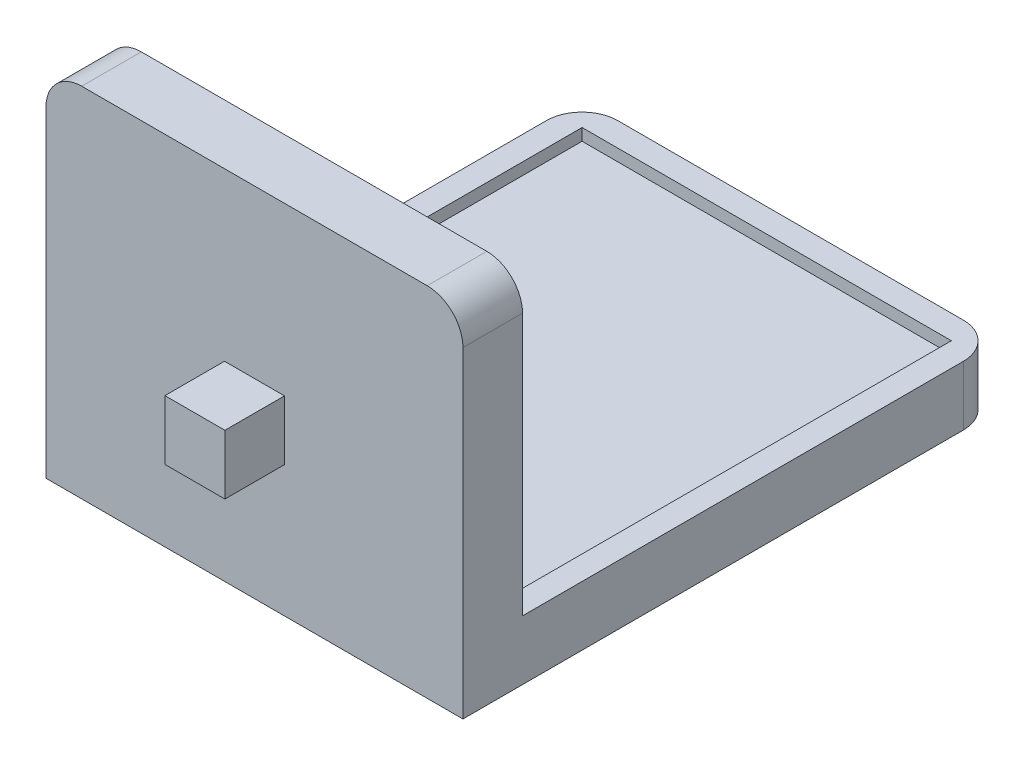
ISO-10303-21;
HEADER;
FILE_DESCRIPTION(('STEP AP214'),'2;1');
FILE_NAME('part.step','',(''),(''),'','','');
FILE_SCHEMA(('AUTOMOTIVE_DESIGN { 1 0 10303 214 1 1 1 1 }'));
ENDSEC;
DATA;
#1=APPLICATION_CONTEXT('core data for automotive mechanical design processes');
#2=APPLICATION_PROTOCOL_DEFINITION('international standard','automotive_design',2000,#1);
#3=PRODUCT_CONTEXT('',#1,'mechanical');
#4=PRODUCT('Part','Part','',(#3));
#5=PRODUCT_RELATED_PRODUCT_CATEGORY('part','',(#4));
#6=PRODUCT_DEFINITION_FORMATION('','',#4);
#7=PRODUCT_DEFINITION_CONTEXT('part definition',#1,'design');
#8=PRODUCT_DEFINITION('design','',#6,#7);
#9=PRODUCT_DEFINITION_SHAPE('','',#8);
#10=(LENGTH_UNIT() NAMED_UNIT(*) SI_UNIT(.MILLI.,.METRE.));
#11=(NAMED_UNIT(*) PLANE_ANGLE_UNIT() SI_UNIT($,.RADIAN.));
#12=(NAMED_UNIT(*) SI_UNIT($,.STERADIAN.) SOLID_ANGLE_UNIT());
#13=UNCERTAINTY_MEASURE_WITH_UNIT(LENGTH_MEASURE(1.E-05),#10,'distance_accuracy_value','');
#14=(GEOMETRIC_REPRESENTATION_CONTEXT(3) GLOBAL_UNCERTAINTY_ASSIGNED_CONTEXT((#13)) GLOBAL_UNIT_ASSIGNED_CONTEXT((#10,
#11,#12)) REPRESENTATION_CONTEXT('',''));
#15=CARTESIAN_POINT('',(0.,0.,0.));
#16=DIRECTION('',(0.,0.,1.));
#17=DIRECTION('',(1.,0.,0.));
#18=AXIS2_PLACEMENT_3D('',#15,#16,#17);
#19=CARTESIAN_POINT('',(0.,0.,5.));
#20=DIRECTION('',(0.,0.,-1.));
#21=DIRECTION('',(-1.,0.,0.));
#22=AXIS2_PLACEMENT_3D('',#19,#20,#21);
#23=PLANE('',#22);
#24=DIRECTION('',(0.,1.,0.));
#25=VECTOR('',#24,1.);
#26=CARTESIAN_POINT('',(35.,0.,5.));
#27=LINE('',#26,#25);
#28=CARTESIAN_POINT('',(35.,0.,5.));
#29=VERTEX_POINT('',#28);
#30=CARTESIAN_POINT('',(35.,27.,5.));
#31=VERTEX_POINT('',#30);
#32=EDGE_CURVE('E234',#29,#31,#27,.T.);
#33=ORIENTED_EDGE('',*,*,#32,.T.);
#34=CARTESIAN_POINT('',(32.,27.,5.));
#35=DIRECTION('',(0.,0.,-1.));
#36=DIRECTION('',(-1.,0.,0.));
#37=AXIS2_PLACEMENT_3D('',#34,#35,#36);
#38=CIRCLE('',#37,3.);
#39=CARTESIAN_POINT('',(32.,30.,5.));
#40=VERTEX_POINT('',#39);
#41=EDGE_CURVE('E69',#31,#40,#38,.F.);
#42=ORIENTED_EDGE('',*,*,#41,.T.);
#43=DIRECTION('',(-1.,0.,0.));
#44=VECTOR('',#43,1.);
#45=CARTESIAN_POINT('',(0.,30.,5.));
#46=LINE('',#45,#44);
#47=CARTESIAN_POINT('',(3.,30.,5.));
#48=VERTEX_POINT('',#47);
#49=EDGE_CURVE('E238',#40,#48,#46,.T.);
#50=ORIENTED_EDGE('',*,*,#49,.T.);
#51=CARTESIAN_POINT('',(3.,27.,5.));
#52=DIRECTION('',(0.,0.,-1.));
#53=DIRECTION('',(-1.,0.,0.));
#54=AXIS2_PLACEMENT_3D('',#51,#52,#53);
#55=CIRCLE('',#54,3.);
#56=CARTESIAN_POINT('',(0.,27.,5.));
#57=VERTEX_POINT('',#56);
#58=EDGE_CURVE('E84',#48,#57,#55,.F.);
#59=ORIENTED_EDGE('',*,*,#58,.T.);
#60=DIRECTION('',(0.,-1.,0.));
#61=VECTOR('',#60,1.);
#62=CARTESIAN_POINT('',(0.,0.,5.));
#63=LINE('',#62,#61);
#64=CARTESIAN_POINT('',(0.,0.,5.));
#65=VERTEX_POINT('',#64);
#66=EDGE_CURVE('E226',#57,#65,#63,.T.);
#67=ORIENTED_EDGE('',*,*,#66,.T.);
#68=DIRECTION('',(1.,0.,0.));
#69=VECTOR('',#68,1.);
#70=CARTESIAN_POINT('',(0.,0.,5.));
#71=LINE('',#70,#69);
#72=EDGE_CURVE('E229',#65,#29,#71,.T.);
#73=ORIENTED_EDGE('',*,*,#72,.T.);
#74=EDGE_LOOP('',(#33,#42,#50,#59,#67,#73));
#75=FACE_BOUND('',#74,.T.);
#76=DIRECTION('',(1.,0.,0.));
#77=VECTOR('',#76,1.);
#78=CARTESIAN_POINT('',(0.,11.,5.));
#79=LINE('',#78,#77);
#80=CARTESIAN_POINT('',(14.9819164068884,11.,5.));
#81=VERTEX_POINT('',#80);
#82=CARTESIAN_POINT('',(20.0180835931116,11.,5.));
#83=VERTEX_POINT('',#82);
#84=EDGE_CURVE('E212',#81,#83,#79,.T.);
#85=ORIENTED_EDGE('',*,*,#84,.F.);
#86=DIRECTION('',(0.,1.,0.));
#87=VECTOR('',#86,1.);
#88=CARTESIAN_POINT('',(14.9819164068884,0.,5.));
#89=LINE('',#88,#87);
#90=CARTESIAN_POINT('',(14.9819164068884,16.,5.));
#91=VERTEX_POINT('',#90);
#92=EDGE_CURVE('E208',#81,#91,#89,.T.);
#93=ORIENTED_EDGE('',*,*,#92,.T.);
#94=DIRECTION('',(1.,0.,0.));
#95=VECTOR('',#94,1.);
#96=CARTESIAN_POINT('',(0.,16.,5.));
#97=LINE('',#96,#95);
#98=CARTESIAN_POINT('',(20.0180835931116,16.,5.));
#99=VERTEX_POINT('',#98);
#100=EDGE_CURVE('E76',#91,#99,#97,.T.);
#101=ORIENTED_EDGE('',*,*,#100,.T.);
#102=DIRECTION('',(0.,1.,0.));
#103=VECTOR('',#102,1.);
#104=CARTESIAN_POINT('',(20.0180835931116,0.,5.));
#105=LINE('',#104,#103);
#106=EDGE_CURVE('E558',#83,#99,#105,.T.);
#107=ORIENTED_EDGE('',*,*,#106,.F.);
#108=EDGE_LOOP('',(#85,#93,#101,#107));
#109=FACE_BOUND('',#108,.T.);
#110=ADVANCED_FACE('F60',(#75,#109),#23,.F.);
#111=CARTESIAN_POINT('',(0.,5.,0.));
#112=DIRECTION('',(1.,0.,0.));
#113=DIRECTION('',(0.,0.,-1.));
#114=AXIS2_PLACEMENT_3D('',#111,#112,#113);
#115=PLANE('',#114);
#116=ORIENTED_EDGE('',*,*,#66,.F.);
#117=DIRECTION('',(0.,0.,-1.));
#118=VECTOR('',#117,1.);
#119=CARTESIAN_POINT('',(0.,27.,0.));
#120=LINE('',#119,#118);
#121=CARTESIAN_POINT('',(0.,27.,0.));
#122=VERTEX_POINT('',#121);
#123=EDGE_CURVE('E11',#57,#122,#120,.T.);
#124=ORIENTED_EDGE('',*,*,#123,.T.);
#125=DIRECTION('',(0.,-1.,0.));
#126=VECTOR('',#125,1.);
#127=CARTESIAN_POINT('',(0.,0.,0.));
#128=LINE('',#127,#126);
#129=CARTESIAN_POINT('',(0.,5.,0.));
#130=VERTEX_POINT('',#129);
#131=EDGE_CURVE('E215',#122,#130,#128,.T.);
#132=ORIENTED_EDGE('',*,*,#131,.T.);
#133=DIRECTION('',(0.,0.,1.));
#134=VECTOR('',#133,1.);
#135=CARTESIAN_POINT('',(0.,5.,0.));
#136=LINE('',#135,#134);
#137=CARTESIAN_POINT('',(0.,5.,-37.));
#138=VERTEX_POINT('',#137);
#139=EDGE_CURVE('E292',#138,#130,#136,.T.);
#140=ORIENTED_EDGE('',*,*,#139,.F.);
#141=DIRECTION('',(0.,-1.,0.));
#142=VECTOR('',#141,1.);
#143=CARTESIAN_POINT('',(0.,5.,-37.));
#144=LINE('',#143,#142);
#145=CARTESIAN_POINT('',(0.,0.,-37.));
#146=VERTEX_POINT('',#145);
#147=EDGE_CURVE('E308',#138,#146,#144,.T.);
#148=ORIENTED_EDGE('',*,*,#147,.T.);
#149=DIRECTION('',(0.,0.,1.));
#150=VECTOR('',#149,1.);
#151=CARTESIAN_POINT('',(0.,0.,0.));
#152=LINE('',#151,#150);
#153=EDGE_CURVE('E282',#146,#65,#152,.T.);
#154=ORIENTED_EDGE('',*,*,#153,.T.);
#155=EDGE_LOOP('',(#116,#124,#132,#140,#148,#154));
#156=FACE_BOUND('',#155,.T.);
#157=ADVANCED_FACE('F404',(#156),#115,.F.);
#158=CARTESIAN_POINT('',(35.,5.,0.));
#159=DIRECTION('',(-1.,0.,0.));
#160=DIRECTION('',(0.,0.,1.));
#161=AXIS2_PLACEMENT_3D('',#158,#159,#160);
#162=PLANE('',#161);
#163=DIRECTION('',(0.,1.,0.));
#164=VECTOR('',#163,1.);
#165=CARTESIAN_POINT('',(35.,0.,0.));
#166=LINE('',#165,#164);
#167=CARTESIAN_POINT('',(35.,5.,0.));
#168=VERTEX_POINT('',#167);
#169=CARTESIAN_POINT('',(35.,27.,0.));
#170=VERTEX_POINT('',#169);
#171=EDGE_CURVE('E220',#168,#170,#166,.T.);
#172=ORIENTED_EDGE('',*,*,#171,.T.);
#173=DIRECTION('',(0.,0.,-1.));
#174=VECTOR('',#173,1.);
#175=CARTESIAN_POINT('',(35.,27.,0.));
#176=LINE('',#175,#174);
#177=EDGE_CURVE('E358',#170,#31,#176,.F.);
#178=ORIENTED_EDGE('',*,*,#177,.T.);
#179=ORIENTED_EDGE('',*,*,#32,.F.);
#180=DIRECTION('',(0.,0.,-1.));
#181=VECTOR('',#180,1.);
#182=CARTESIAN_POINT('',(35.,0.,0.));
#183=LINE('',#182,#181);
#184=CARTESIAN_POINT('',(35.,0.,-37.));
#185=VERTEX_POINT('',#184);
#186=EDGE_CURVE('E312',#29,#185,#183,.T.);
#187=ORIENTED_EDGE('',*,*,#186,.T.);
#188=DIRECTION('',(0.,-1.,0.));
#189=VECTOR('',#188,1.);
#190=CARTESIAN_POINT('',(35.,5.,-37.));
#191=LINE('',#190,#189);
#192=CARTESIAN_POINT('',(35.,5.,-37.));
#193=VERTEX_POINT('',#192);
#194=EDGE_CURVE('E339',#185,#193,#191,.F.);
#195=ORIENTED_EDGE('',*,*,#194,.T.);
#196=DIRECTION('',(0.,0.,-1.));
#197=VECTOR('',#196,1.);
#198=CARTESIAN_POINT('',(35.,5.,0.));
#199=LINE('',#198,#197);
#200=EDGE_CURVE('E301',#168,#193,#199,.T.);
#201=ORIENTED_EDGE('',*,*,#200,.F.);
#202=EDGE_LOOP('',(#172,#178,#179,#187,#195,#201));
#203=FACE_BOUND('',#202,.T.);
#204=ADVANCED_FACE('F381',(#203),#162,.F.);
#205=CARTESIAN_POINT('',(0.,5.,-40.));
#206=DIRECTION('',(0.,0.,1.));
#207=DIRECTION('',(1.,0.,0.));
#208=AXIS2_PLACEMENT_3D('',#205,#206,#207);
#209=PLANE('',#208);
#210=DIRECTION('',(-1.,0.,0.));
#211=VECTOR('',#210,1.);
#212=CARTESIAN_POINT('',(0.,5.,-40.));
#213=LINE('',#212,#211);
#214=CARTESIAN_POINT('',(32.,5.,-40.));
#215=VERTEX_POINT('',#214);
#216=CARTESIAN_POINT('',(3.,5.,-40.));
#217=VERTEX_POINT('',#216);
#218=EDGE_CURVE('E305',#215,#217,#213,.T.);
#219=ORIENTED_EDGE('',*,*,#218,.F.);
#220=DIRECTION('',(0.,-1.,0.));
#221=VECTOR('',#220,1.);
#222=CARTESIAN_POINT('',(32.,5.,-40.));
#223=LINE('',#222,#221);
#224=CARTESIAN_POINT('',(32.,0.,-40.));
#225=VERTEX_POINT('',#224);
#226=EDGE_CURVE('E332',#215,#225,#223,.T.);
#227=ORIENTED_EDGE('',*,*,#226,.T.);
#228=DIRECTION('',(-1.,0.,0.));
#229=VECTOR('',#228,1.);
#230=CARTESIAN_POINT('',(0.,0.,-40.));
#231=LINE('',#230,#229);
#232=CARTESIAN_POINT('',(3.,0.,-40.));
#233=VERTEX_POINT('',#232);
#234=EDGE_CURVE('E297',#225,#233,#231,.T.);
#235=ORIENTED_EDGE('',*,*,#234,.T.);
#236=DIRECTION('',(0.,-1.,0.));
#237=VECTOR('',#236,1.);
#238=CARTESIAN_POINT('',(3.,5.,-40.));
#239=LINE('',#238,#237);
#240=EDGE_CURVE('E325',#233,#217,#239,.F.);
#241=ORIENTED_EDGE('',*,*,#240,.T.);
#242=EDGE_LOOP('',(#219,#227,#235,#241));
#243=FACE_BOUND('',#242,.T.);
#244=ADVANCED_FACE('F392',(#243),#209,.F.);
#245=CARTESIAN_POINT('',(0.,5.,0.));
#246=DIRECTION('',(0.,-1.,0.));
#247=DIRECTION('',(0.,0.,-1.));
#248=AXIS2_PLACEMENT_3D('',#245,#246,#247);
#249=PLANE('',#248);
#250=DIRECTION('',(1.,0.,0.));
#251=VECTOR('',#250,1.);
#252=CARTESIAN_POINT('',(2.,5.,-2.));
#253=LINE('',#252,#251);
#254=CARTESIAN_POINT('',(2.,5.,-2.));
#255=VERTEX_POINT('',#254);
#256=CARTESIAN_POINT('',(33.,5.,-2.));
#257=VERTEX_POINT('',#256);
#258=EDGE_CURVE('E268',#255,#257,#253,.T.);
#259=ORIENTED_EDGE('',*,*,#258,.F.);
#260=DIRECTION('',(0.,0.,1.));
#261=VECTOR('',#260,1.);
#262=CARTESIAN_POINT('',(2.,5.,-38.));
#263=LINE('',#262,#261);
#264=CARTESIAN_POINT('',(2.,5.,-38.));
#265=VERTEX_POINT('',#264);
#266=EDGE_CURVE('E240',#265,#255,#263,.T.);
#267=ORIENTED_EDGE('',*,*,#266,.F.);
#268=DIRECTION('',(-1.,0.,0.));
#269=VECTOR('',#268,1.);
#270=CARTESIAN_POINT('',(33.,5.,-38.));
#271=LINE('',#270,#269);
#272=CARTESIAN_POINT('',(33.,5.,-38.));
#273=VERTEX_POINT('',#272);
#274=EDGE_CURVE('E253',#273,#265,#271,.T.);
#275=ORIENTED_EDGE('',*,*,#274,.F.);
#276=DIRECTION('',(0.,0.,-1.));
#277=VECTOR('',#276,1.);
#278=CARTESIAN_POINT('',(33.,5.,-2.));
#279=LINE('',#278,#277);
#280=EDGE_CURVE('E272',#257,#273,#279,.T.);
#281=ORIENTED_EDGE('',*,*,#280,.F.);
#282=EDGE_LOOP('',(#259,#267,#275,#281));
#283=FACE_BOUND('',#282,.T.);
#284=ORIENTED_EDGE('',*,*,#200,.T.);
#285=CARTESIAN_POINT('',(32.,5.,-37.));
#286=DIRECTION('',(0.,-1.,0.));
#287=DIRECTION('',(0.,0.,-1.));
#288=AXIS2_PLACEMENT_3D('',#285,#286,#287);
#289=CIRCLE('',#288,3.);
#290=EDGE_CURVE('E342',#193,#215,#289,.F.);
#291=ORIENTED_EDGE('',*,*,#290,.T.);
#292=ORIENTED_EDGE('',*,*,#218,.T.);
#293=CARTESIAN_POINT('',(3.,5.,-37.));
#294=DIRECTION('',(0.,-1.,0.));
#295=DIRECTION('',(0.,0.,-1.));
#296=AXIS2_PLACEMENT_3D('',#293,#294,#295);
#297=CIRCLE('',#296,3.);
#298=EDGE_CURVE('E329',#217,#138,#297,.F.);
#299=ORIENTED_EDGE('',*,*,#298,.T.);
#300=ORIENTED_EDGE('',*,*,#139,.T.);
#301=DIRECTION('',(1.,0.,0.));
#302=VECTOR('',#301,1.);
#303=CARTESIAN_POINT('',(0.,5.,0.));
#304=LINE('',#303,#302);
#305=EDGE_CURVE('E296',#130,#168,#304,.T.);
#306=ORIENTED_EDGE('',*,*,#305,.T.);
#307=EDGE_LOOP('',(#284,#291,#292,#299,#300,#306));
#308=FACE_BOUND('',#307,.T.);
#309=ADVANCED_FACE('F385',(#283,#308),#249,.F.);
#310=CARTESIAN_POINT('',(0.,0.,0.));
#311=DIRECTION('',(0.,-1.,0.));
#312=DIRECTION('',(0.,0.,-1.));
#313=AXIS2_PLACEMENT_3D('',#310,#311,#312);
#314=PLANE('',#313);
#315=ORIENTED_EDGE('',*,*,#234,.F.);
#316=CARTESIAN_POINT('',(32.,0.,-37.));
#317=DIRECTION('',(0.,-1.,0.));
#318=DIRECTION('',(0.,0.,-1.));
#319=AXIS2_PLACEMENT_3D('',#316,#317,#318);
#320=CIRCLE('',#319,3.);
#321=EDGE_CURVE('E336',#225,#185,#320,.T.);
#322=ORIENTED_EDGE('',*,*,#321,.T.);
#323=ORIENTED_EDGE('',*,*,#186,.F.);
#324=ORIENTED_EDGE('',*,*,#72,.F.);
#325=ORIENTED_EDGE('',*,*,#153,.F.);
#326=CARTESIAN_POINT('',(3.,0.,-37.));
#327=DIRECTION('',(0.,-1.,0.));
#328=DIRECTION('',(0.,0.,-1.));
#329=AXIS2_PLACEMENT_3D('',#326,#327,#328);
#330=CIRCLE('',#329,3.);
#331=EDGE_CURVE('E321',#146,#233,#330,.T.);
#332=ORIENTED_EDGE('',*,*,#331,.T.);
#333=EDGE_LOOP('',(#315,#322,#323,#324,#325,#332));
#334=FACE_BOUND('',#333,.T.);
#335=ADVANCED_FACE('F394',(#334),#314,.T.);
#336=CARTESIAN_POINT('',(2.,4.,-38.));
#337=DIRECTION('',(-1.,0.,0.));
#338=DIRECTION('',(0.,0.,1.));
#339=AXIS2_PLACEMENT_3D('',#336,#337,#338);
#340=PLANE('',#339);
#341=ORIENTED_EDGE('',*,*,#266,.T.);
#342=DIRECTION('',(0.,1.,0.));
#343=VECTOR('',#342,1.);
#344=CARTESIAN_POINT('',(2.,4.,-2.));
#345=LINE('',#344,#343);
#346=CARTESIAN_POINT('',(2.,4.,-2.));
#347=VERTEX_POINT('',#346);
#348=EDGE_CURVE('E265',#347,#255,#345,.T.);
#349=ORIENTED_EDGE('',*,*,#348,.F.);
#350=DIRECTION('',(0.,0.,1.));
#351=VECTOR('',#350,1.);
#352=CARTESIAN_POINT('',(2.,4.,-38.));
#353=LINE('',#352,#351);
#354=CARTESIAN_POINT('',(2.,4.,-38.));
#355=VERTEX_POINT('',#354);
#356=EDGE_CURVE('E248',#355,#347,#353,.T.);
#357=ORIENTED_EDGE('',*,*,#356,.F.);
#358=DIRECTION('',(0.,1.,0.));
#359=VECTOR('',#358,1.);
#360=CARTESIAN_POINT('',(2.,4.,-38.));
#361=LINE('',#360,#359);
#362=EDGE_CURVE('E279',#355,#265,#361,.T.);
#363=ORIENTED_EDGE('',*,*,#362,.T.);
#364=EDGE_LOOP('',(#341,#349,#357,#363));
#365=FACE_BOUND('',#364,.T.);
#366=ADVANCED_FACE('F435',(#365),#340,.F.);
#367=CARTESIAN_POINT('',(33.,4.,-38.));
#368=DIRECTION('',(0.,0.,-1.));
#369=DIRECTION('',(-1.,0.,0.));
#370=AXIS2_PLACEMENT_3D('',#367,#368,#369);
#371=PLANE('',#370);
#372=ORIENTED_EDGE('',*,*,#274,.T.);
#373=ORIENTED_EDGE('',*,*,#362,.F.);
#374=DIRECTION('',(-1.,0.,0.));
#375=VECTOR('',#374,1.);
#376=CARTESIAN_POINT('',(33.,4.,-38.));
#377=LINE('',#376,#375);
#378=CARTESIAN_POINT('',(33.,4.,-38.));
#379=VERTEX_POINT('',#378);
#380=EDGE_CURVE('E261',#379,#355,#377,.T.);
#381=ORIENTED_EDGE('',*,*,#380,.F.);
#382=DIRECTION('',(0.,1.,0.));
#383=VECTOR('',#382,1.);
#384=CARTESIAN_POINT('',(33.,4.,-38.));
#385=LINE('',#384,#383);
#386=EDGE_CURVE('E283',#379,#273,#385,.T.);
#387=ORIENTED_EDGE('',*,*,#386,.T.);
#388=EDGE_LOOP('',(#372,#373,#381,#387));
#389=FACE_BOUND('',#388,.T.);
#390=ADVANCED_FACE('F431',(#389),#371,.F.);
#391=CARTESIAN_POINT('',(33.,4.,-2.));
#392=DIRECTION('',(1.,0.,0.));
#393=DIRECTION('',(0.,0.,-1.));
#394=AXIS2_PLACEMENT_3D('',#391,#392,#393);
#395=PLANE('',#394);
#396=ORIENTED_EDGE('',*,*,#280,.T.);
#397=ORIENTED_EDGE('',*,*,#386,.F.);
#398=DIRECTION('',(0.,0.,-1.));
#399=VECTOR('',#398,1.);
#400=CARTESIAN_POINT('',(33.,4.,-2.));
#401=LINE('',#400,#399);
#402=CARTESIAN_POINT('',(33.,4.,-2.));
#403=VERTEX_POINT('',#402);
#404=EDGE_CURVE('E257',#403,#379,#401,.T.);
#405=ORIENTED_EDGE('',*,*,#404,.F.);
#406=DIRECTION('',(0.,1.,0.));
#407=VECTOR('',#406,1.);
#408=CARTESIAN_POINT('',(33.,4.,-2.));
#409=LINE('',#408,#407);
#410=EDGE_CURVE('E286',#403,#257,#409,.T.);
#411=ORIENTED_EDGE('',*,*,#410,.T.);
#412=EDGE_LOOP('',(#396,#397,#405,#411));
#413=FACE_BOUND('',#412,.T.);
#414=ADVANCED_FACE('F434',(#413),#395,.F.);
#415=CARTESIAN_POINT('',(2.,4.,-2.));
#416=DIRECTION('',(0.,0.,1.));
#417=DIRECTION('',(1.,0.,0.));
#418=AXIS2_PLACEMENT_3D('',#415,#416,#417);
#419=PLANE('',#418);
#420=ORIENTED_EDGE('',*,*,#258,.T.);
#421=ORIENTED_EDGE('',*,*,#410,.F.);
#422=DIRECTION('',(1.,0.,0.));
#423=VECTOR('',#422,1.);
#424=CARTESIAN_POINT('',(2.,4.,-2.));
#425=LINE('',#424,#423);
#426=EDGE_CURVE('E252',#347,#403,#425,.T.);
#427=ORIENTED_EDGE('',*,*,#426,.F.);
#428=ORIENTED_EDGE('',*,*,#348,.T.);
#429=EDGE_LOOP('',(#420,#421,#427,#428));
#430=FACE_BOUND('',#429,.T.);
#431=ADVANCED_FACE('F429',(#430),#419,.F.);
#432=CARTESIAN_POINT('',(0.,4.,0.));
#433=DIRECTION('',(0.,1.,0.));
#434=DIRECTION('',(0.,0.,1.));
#435=AXIS2_PLACEMENT_3D('',#432,#433,#434);
#436=PLANE('',#435);
#437=ORIENTED_EDGE('',*,*,#356,.T.);
#438=ORIENTED_EDGE('',*,*,#426,.T.);
#439=ORIENTED_EDGE('',*,*,#404,.T.);
#440=ORIENTED_EDGE('',*,*,#380,.T.);
#441=EDGE_LOOP('',(#437,#438,#439,#440));
#442=FACE_BOUND('',#441,.T.);
#443=ADVANCED_FACE('F424',(#442),#436,.T.);
#444=CARTESIAN_POINT('',(0.,0.,0.));
#445=DIRECTION('',(0.,0.,-1.));
#446=DIRECTION('',(-1.,0.,0.));
#447=AXIS2_PLACEMENT_3D('',#444,#445,#446);
#448=PLANE('',#447);
#449=DIRECTION('',(-1.,0.,0.));
#450=VECTOR('',#449,1.);
#451=CARTESIAN_POINT('',(0.,30.,0.));
#452=LINE('',#451,#450);
#453=CARTESIAN_POINT('',(32.,30.,0.));
#454=VERTEX_POINT('',#453);
#455=CARTESIAN_POINT('',(3.,30.,0.));
#456=VERTEX_POINT('',#455);
#457=EDGE_CURVE('E230',#454,#456,#452,.T.);
#458=ORIENTED_EDGE('',*,*,#457,.F.);
#459=CARTESIAN_POINT('',(32.,27.,0.));
#460=DIRECTION('',(0.,0.,-1.));
#461=DIRECTION('',(-1.,0.,0.));
#462=AXIS2_PLACEMENT_3D('',#459,#460,#461);
#463=CIRCLE('',#462,3.);
#464=EDGE_CURVE('E355',#454,#170,#463,.T.);
#465=ORIENTED_EDGE('',*,*,#464,.T.);
#466=ORIENTED_EDGE('',*,*,#171,.F.);
#467=ORIENTED_EDGE('',*,*,#305,.F.);
#468=ORIENTED_EDGE('',*,*,#131,.F.);
#469=CARTESIAN_POINT('',(3.,27.,0.));
#470=DIRECTION('',(0.,0.,-1.));
#471=DIRECTION('',(-1.,0.,0.));
#472=AXIS2_PLACEMENT_3D('',#469,#470,#471);
#473=CIRCLE('',#472,3.);
#474=EDGE_CURVE('E352',#122,#456,#473,.T.);
#475=ORIENTED_EDGE('',*,*,#474,.T.);
#476=EDGE_LOOP('',(#458,#465,#466,#467,#468,#475));
#477=FACE_BOUND('',#476,.T.);
#478=ADVANCED_FACE('F377',(#477),#448,.T.);
#479=CARTESIAN_POINT('',(0.,30.,5.));
#480=DIRECTION('',(0.,-1.,0.));
#481=DIRECTION('',(0.,0.,-1.));
#482=AXIS2_PLACEMENT_3D('',#479,#480,#481);
#483=PLANE('',#482);
#484=ORIENTED_EDGE('',*,*,#49,.F.);
#485=DIRECTION('',(0.,0.,-1.));
#486=VECTOR('',#485,1.);
#487=CARTESIAN_POINT('',(32.,30.,5.));
#488=LINE('',#487,#486);
#489=EDGE_CURVE('E348',#40,#454,#488,.T.);
#490=ORIENTED_EDGE('',*,*,#489,.T.);
#491=ORIENTED_EDGE('',*,*,#457,.T.);
#492=DIRECTION('',(0.,0.,-1.));
#493=VECTOR('',#492,1.);
#494=CARTESIAN_POINT('',(3.,30.,5.));
#495=LINE('',#494,#493);
#496=EDGE_CURVE('E345',#456,#48,#495,.F.);
#497=ORIENTED_EDGE('',*,*,#496,.T.);
#498=EDGE_LOOP('',(#484,#490,#491,#497));
#499=FACE_BOUND('',#498,.T.);
#500=ADVANCED_FACE('F372',(#499),#483,.F.);
#501=CARTESIAN_POINT('',(3.,5.,-37.));
#502=DIRECTION('',(0.,-1.,0.));
#503=DIRECTION('',(0.,0.,-1.));
#504=AXIS2_PLACEMENT_3D('',#501,#502,#503);
#505=CYLINDRICAL_SURFACE('',#504,3.);
#506=ORIENTED_EDGE('',*,*,#298,.F.);
#507=ORIENTED_EDGE('',*,*,#240,.F.);
#508=ORIENTED_EDGE('',*,*,#331,.F.);
#509=ORIENTED_EDGE('',*,*,#147,.F.);
#510=EDGE_LOOP('',(#506,#507,#508,#509));
#511=FACE_BOUND('',#510,.T.);
#512=ADVANCED_FACE('F401',(#511),#505,.T.);
#513=CARTESIAN_POINT('',(32.,5.,-37.));
#514=DIRECTION('',(0.,-1.,0.));
#515=DIRECTION('',(0.,0.,-1.));
#516=AXIS2_PLACEMENT_3D('',#513,#514,#515);
#517=CYLINDRICAL_SURFACE('',#516,3.);
#518=ORIENTED_EDGE('',*,*,#290,.F.);
#519=ORIENTED_EDGE('',*,*,#194,.F.);
#520=ORIENTED_EDGE('',*,*,#321,.F.);
#521=ORIENTED_EDGE('',*,*,#226,.F.);
#522=EDGE_LOOP('',(#518,#519,#520,#521));
#523=FACE_BOUND('',#522,.T.);
#524=ADVANCED_FACE('F389',(#523),#517,.T.);
#525=CARTESIAN_POINT('',(32.,27.,5.));
#526=DIRECTION('',(0.,0.,-1.));
#527=DIRECTION('',(-1.,0.,0.));
#528=AXIS2_PLACEMENT_3D('',#525,#526,#527);
#529=CYLINDRICAL_SURFACE('',#528,3.);
#530=ORIENTED_EDGE('',*,*,#41,.F.);
#531=ORIENTED_EDGE('',*,*,#177,.F.);
#532=ORIENTED_EDGE('',*,*,#464,.F.);
#533=ORIENTED_EDGE('',*,*,#489,.F.);
#534=EDGE_LOOP('',(#530,#531,#532,#533));
#535=FACE_BOUND('',#534,.T.);
#536=ADVANCED_FACE('F375',(#535),#529,.T.);
#537=CARTESIAN_POINT('',(3.,27.,0.));
#538=DIRECTION('',(0.,0.,-1.));
#539=DIRECTION('',(-1.,0.,0.));
#540=AXIS2_PLACEMENT_3D('',#537,#538,#539);
#541=CYLINDRICAL_SURFACE('',#540,3.);
#542=ORIENTED_EDGE('',*,*,#58,.F.);
#543=ORIENTED_EDGE('',*,*,#496,.F.);
#544=ORIENTED_EDGE('',*,*,#474,.F.);
#545=ORIENTED_EDGE('',*,*,#123,.F.);
#546=EDGE_LOOP('',(#542,#543,#544,#545));
#547=FACE_BOUND('',#546,.T.);
#548=ADVANCED_FACE('F62',(#547),#541,.T.);
#549=CARTESIAN_POINT('',(0.,11.,10.));
#550=DIRECTION('',(0.,1.,0.));
#551=DIRECTION('',(0.,0.,1.));
#552=AXIS2_PLACEMENT_3D('',#549,#550,#551);
#553=PLANE('',#552);
#554=ORIENTED_EDGE('',*,*,#84,.T.);
#555=DIRECTION('',(0.,0.,-1.));
#556=VECTOR('',#555,1.);
#557=CARTESIAN_POINT('',(20.0180835931116,11.,10.));
#558=LINE('',#557,#556);
#559=CARTESIAN_POINT('',(20.0180835931116,11.,10.));
#560=VERTEX_POINT('',#559);
#561=EDGE_CURVE('E191',#560,#83,#558,.T.);
#562=ORIENTED_EDGE('',*,*,#561,.F.);
#563=DIRECTION('',(1.,0.,0.));
#564=VECTOR('',#563,1.);
#565=CARTESIAN_POINT('',(0.,11.,10.));
#566=LINE('',#565,#564);
#567=CARTESIAN_POINT('',(14.9819164068884,11.,10.));
#568=VERTEX_POINT('',#567);
#569=EDGE_CURVE('E199',#568,#560,#566,.T.);
#570=ORIENTED_EDGE('',*,*,#569,.F.);
#571=DIRECTION('',(0.,0.,-1.));
#572=VECTOR('',#571,1.);
#573=CARTESIAN_POINT('',(14.9819164068884,11.,10.));
#574=LINE('',#573,#572);
#575=EDGE_CURVE('E555',#568,#81,#574,.T.);
#576=ORIENTED_EDGE('',*,*,#575,.T.);
#577=EDGE_LOOP('',(#554,#562,#570,#576));
#578=FACE_BOUND('',#577,.T.);
#579=ADVANCED_FACE('F210',(#578),#553,.F.);
#580=CARTESIAN_POINT('',(20.0180835931116,0.,10.));
#581=DIRECTION('',(-1.,0.,0.));
#582=DIRECTION('',(0.,0.,1.));
#583=AXIS2_PLACEMENT_3D('',#580,#581,#582);
#584=PLANE('',#583);
#585=ORIENTED_EDGE('',*,*,#106,.T.);
#586=DIRECTION('',(0.,0.,-1.));
#587=VECTOR('',#586,1.);
#588=CARTESIAN_POINT('',(20.0180835931116,16.,10.));
#589=LINE('',#588,#587);
#590=CARTESIAN_POINT('',(20.0180835931116,16.,10.));
#591=VERTEX_POINT('',#590);
#592=EDGE_CURVE('E193',#591,#99,#589,.T.);
#593=ORIENTED_EDGE('',*,*,#592,.F.);
#594=DIRECTION('',(0.,1.,0.));
#595=VECTOR('',#594,1.);
#596=CARTESIAN_POINT('',(20.0180835931116,0.,10.));
#597=LINE('',#596,#595);
#598=EDGE_CURVE('E186',#560,#591,#597,.T.);
#599=ORIENTED_EDGE('',*,*,#598,.F.);
#600=ORIENTED_EDGE('',*,*,#561,.T.);
#601=EDGE_LOOP('',(#585,#593,#599,#600));
#602=FACE_BOUND('',#601,.T.);
#603=ADVANCED_FACE('F189',(#602),#584,.F.);
#604=CARTESIAN_POINT('',(0.,16.,10.));
#605=DIRECTION('',(0.,1.,0.));
#606=DIRECTION('',(0.,0.,1.));
#607=AXIS2_PLACEMENT_3D('',#604,#605,#606);
#608=PLANE('',#607);
#609=ORIENTED_EDGE('',*,*,#100,.F.);
#610=DIRECTION('',(0.,0.,-1.));
#611=VECTOR('',#610,1.);
#612=CARTESIAN_POINT('',(14.9819164068884,16.,10.));
#613=LINE('',#612,#611);
#614=CARTESIAN_POINT('',(14.9819164068884,16.,10.));
#615=VERTEX_POINT('',#614);
#616=EDGE_CURVE('E222',#615,#91,#613,.T.);
#617=ORIENTED_EDGE('',*,*,#616,.F.);
#618=DIRECTION('',(1.,0.,0.));
#619=VECTOR('',#618,1.);
#620=CARTESIAN_POINT('',(0.,16.,10.));
#621=LINE('',#620,#619);
#622=EDGE_CURVE('E198',#615,#591,#621,.T.);
#623=ORIENTED_EDGE('',*,*,#622,.T.);
#624=ORIENTED_EDGE('',*,*,#592,.T.);
#625=EDGE_LOOP('',(#609,#617,#623,#624));
#626=FACE_BOUND('',#625,.T.);
#627=ADVANCED_FACE('F519',(#626),#608,.T.);
#628=CARTESIAN_POINT('',(14.9819164068884,0.,10.));
#629=DIRECTION('',(-1.,0.,0.));
#630=DIRECTION('',(0.,0.,1.));
#631=AXIS2_PLACEMENT_3D('',#628,#629,#630);
#632=PLANE('',#631);
#633=ORIENTED_EDGE('',*,*,#92,.F.);
#634=ORIENTED_EDGE('',*,*,#575,.F.);
#635=DIRECTION('',(0.,1.,0.));
#636=VECTOR('',#635,1.);
#637=CARTESIAN_POINT('',(14.9819164068884,0.,10.));
#638=LINE('',#637,#636);
#639=EDGE_CURVE('E205',#568,#615,#638,.T.);
#640=ORIENTED_EDGE('',*,*,#639,.T.);
#641=ORIENTED_EDGE('',*,*,#616,.T.);
#642=EDGE_LOOP('',(#633,#634,#640,#641));
#643=FACE_BOUND('',#642,.T.);
#644=ADVANCED_FACE('F527',(#643),#632,.T.);
#645=CARTESIAN_POINT('',(0.,0.,10.));
#646=DIRECTION('',(0.,0.,1.));
#647=DIRECTION('',(1.,0.,0.));
#648=AXIS2_PLACEMENT_3D('',#645,#646,#647);
#649=PLANE('',#648);
#650=ORIENTED_EDGE('',*,*,#569,.T.);
#651=ORIENTED_EDGE('',*,*,#598,.T.);
#652=ORIENTED_EDGE('',*,*,#622,.F.);
#653=ORIENTED_EDGE('',*,*,#639,.F.);
#654=EDGE_LOOP('',(#650,#651,#652,#653));
#655=FACE_BOUND('',#654,.T.);
#656=ADVANCED_FACE('F203',(#655),#649,.T.);
#657=CLOSED_SHELL('',(#110,#157,#204,#244,#309,#335,#366,#390,#414,#431,#443,#478,#500,#512,
#524,#536,#548,#579,#603,#627,#644,#656));
#658=MANIFOLD_SOLID_BREP('B2',#657);
#659=ADVANCED_BREP_SHAPE_REPRESENTATION('',(#18,#658),#14);
#660=SHAPE_DEFINITION_REPRESENTATION(#9,#659);
ENDSEC;
END-ISO-10303-21;
